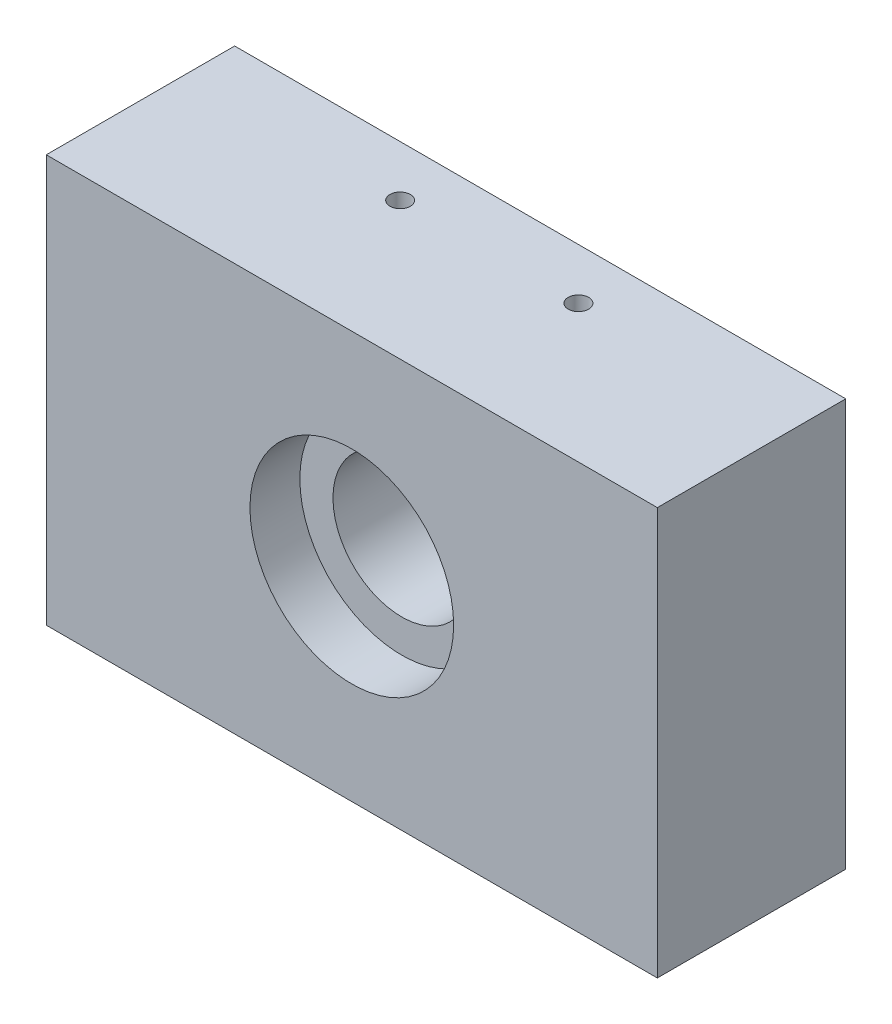
ISO-10303-21;
HEADER;
FILE_DESCRIPTION(('STEP AP214'),'2;1');
FILE_NAME('part.step','',(''),(''),'','','');
FILE_SCHEMA(('AUTOMOTIVE_DESIGN { 1 0 10303 214 1 1 1 1 }'));
ENDSEC;
DATA;
#1=APPLICATION_CONTEXT('core data for automotive mechanical design processes');
#2=APPLICATION_PROTOCOL_DEFINITION('international standard','automotive_design',2000,#1);
#3=PRODUCT_CONTEXT('',#1,'mechanical');
#4=PRODUCT('Part','Part','',(#3));
#5=PRODUCT_RELATED_PRODUCT_CATEGORY('part','',(#4));
#6=PRODUCT_DEFINITION_FORMATION('','',#4);
#7=PRODUCT_DEFINITION_CONTEXT('part definition',#1,'design');
#8=PRODUCT_DEFINITION('design','',#6,#7);
#9=PRODUCT_DEFINITION_SHAPE('','',#8);
#10=(LENGTH_UNIT() NAMED_UNIT(*) SI_UNIT(.MILLI.,.METRE.));
#11=(NAMED_UNIT(*) PLANE_ANGLE_UNIT() SI_UNIT($,.RADIAN.));
#12=(NAMED_UNIT(*) SI_UNIT($,.STERADIAN.) SOLID_ANGLE_UNIT());
#13=UNCERTAINTY_MEASURE_WITH_UNIT(LENGTH_MEASURE(1.E-05),#10,'distance_accuracy_value','');
#14=(GEOMETRIC_REPRESENTATION_CONTEXT(3) GLOBAL_UNCERTAINTY_ASSIGNED_CONTEXT((#13)) GLOBAL_UNIT_ASSIGNED_CONTEXT((#10,
#11,#12)) REPRESENTATION_CONTEXT('',''));
#15=CARTESIAN_POINT('',(0.,0.,0.));
#16=DIRECTION('',(0.,0.,1.));
#17=DIRECTION('',(1.,0.,0.));
#18=AXIS2_PLACEMENT_3D('',#15,#16,#17);
#19=CARTESIAN_POINT('',(76.2,50.8,46.99));
#20=DIRECTION('',(0.,0.,-1.));
#21=DIRECTION('',(-1.,0.,0.));
#22=AXIS2_PLACEMENT_3D('',#19,#20,#21);
#23=CYLINDRICAL_SURFACE('',#22,17.145);
#24=CARTESIAN_POINT('',(76.2,50.8,12.446));
#25=DIRECTION('',(0.,0.,-1.));
#26=DIRECTION('',(-1.,0.,0.));
#27=AXIS2_PLACEMENT_3D('',#24,#25,#26);
#28=CIRCLE('',#27,17.145);
#29=CARTESIAN_POINT('',(59.055,50.8,12.446));
#30=VERTEX_POINT('',#29);
#31=EDGE_CURVE('E147',#30,#30,#28,.T.);
#32=ORIENTED_EDGE('',*,*,#31,.T.);
#33=EDGE_LOOP('',(#32));
#34=FACE_BOUND('',#33,.T.);
#35=CARTESIAN_POINT('',(76.2,50.8,34.544));
#36=DIRECTION('',(0.,0.,-1.));
#37=DIRECTION('',(-1.,0.,0.));
#38=AXIS2_PLACEMENT_3D('',#35,#36,#37);
#39=CIRCLE('',#38,17.145);
#40=CARTESIAN_POINT('',(59.055,50.8,34.544));
#41=VERTEX_POINT('',#40);
#42=EDGE_CURVE('E140',#41,#41,#39,.T.);
#43=ORIENTED_EDGE('',*,*,#42,.F.);
#44=EDGE_LOOP('',(#43));
#45=FACE_BOUND('',#44,.T.);
#46=ADVANCED_FACE('F46',(#34,#45),#23,.F.);
#47=CARTESIAN_POINT('',(0.,0.,46.99));
#48=DIRECTION('',(0.,0.,-1.));
#49=DIRECTION('',(-1.,0.,0.));
#50=AXIS2_PLACEMENT_3D('',#47,#48,#49);
#51=PLANE('',#50);
#52=DIRECTION('',(0.,-1.,0.));
#53=VECTOR('',#52,1.);
#54=CARTESIAN_POINT('',(0.,0.,46.99));
#55=LINE('',#54,#53);
#56=CARTESIAN_POINT('',(0.,101.6,46.99));
#57=VERTEX_POINT('',#56);
#58=CARTESIAN_POINT('',(0.,0.,46.99));
#59=VERTEX_POINT('',#58);
#60=EDGE_CURVE('E159',#57,#59,#55,.T.);
#61=ORIENTED_EDGE('',*,*,#60,.T.);
#62=DIRECTION('',(1.,0.,0.));
#63=VECTOR('',#62,1.);
#64=CARTESIAN_POINT('',(0.,0.,46.99));
#65=LINE('',#64,#63);
#66=CARTESIAN_POINT('',(152.4,0.,46.99));
#67=VERTEX_POINT('',#66);
#68=EDGE_CURVE('E94',#59,#67,#65,.T.);
#69=ORIENTED_EDGE('',*,*,#68,.T.);
#70=DIRECTION('',(0.,1.,0.));
#71=VECTOR('',#70,1.);
#72=CARTESIAN_POINT('',(152.4,0.,46.99));
#73=LINE('',#72,#71);
#74=CARTESIAN_POINT('',(152.4,101.6,46.99));
#75=VERTEX_POINT('',#74);
#76=EDGE_CURVE('E162',#67,#75,#73,.T.);
#77=ORIENTED_EDGE('',*,*,#76,.T.);
#78=DIRECTION('',(-1.,0.,0.));
#79=VECTOR('',#78,1.);
#80=CARTESIAN_POINT('',(0.,101.6,46.99));
#81=LINE('',#80,#79);
#82=EDGE_CURVE('E63',#75,#57,#81,.T.);
#83=ORIENTED_EDGE('',*,*,#82,.T.);
#84=EDGE_LOOP('',(#61,#69,#77,#83));
#85=FACE_BOUND('',#84,.T.);
#86=CARTESIAN_POINT('',(76.2,50.8,46.99));
#87=DIRECTION('',(0.,0.,-1.));
#88=DIRECTION('',(-1.,0.,0.));
#89=AXIS2_PLACEMENT_3D('',#86,#87,#88);
#90=CIRCLE('',#89,25.4);
#91=CARTESIAN_POINT('',(50.8,50.8,46.99));
#92=VERTEX_POINT('',#91);
#93=EDGE_CURVE('E143',#92,#92,#90,.T.);
#94=ORIENTED_EDGE('',*,*,#93,.T.);
#95=EDGE_LOOP('',(#94));
#96=FACE_BOUND('',#95,.T.);
#97=ADVANCED_FACE('F198',(#85,#96),#51,.F.);
#98=CARTESIAN_POINT('',(0.,0.,46.99));
#99=DIRECTION('',(1.,0.,0.));
#100=DIRECTION('',(0.,1.,0.));
#101=AXIS2_PLACEMENT_3D('',#98,#99,#100);
#102=PLANE('',#101);
#103=DIRECTION('',(0.,-1.,0.));
#104=VECTOR('',#103,1.);
#105=CARTESIAN_POINT('',(0.,0.,0.));
#106=LINE('',#105,#104);
#107=CARTESIAN_POINT('',(0.,101.6,0.));
#108=VERTEX_POINT('',#107);
#109=CARTESIAN_POINT('',(0.,0.,0.));
#110=VERTEX_POINT('',#109);
#111=EDGE_CURVE('E156',#108,#110,#106,.T.);
#112=ORIENTED_EDGE('',*,*,#111,.T.);
#113=DIRECTION('',(0.,0.,-1.));
#114=VECTOR('',#113,1.);
#115=CARTESIAN_POINT('',(0.,0.,46.99));
#116=LINE('',#115,#114);
#117=EDGE_CURVE('E11',#59,#110,#116,.T.);
#118=ORIENTED_EDGE('',*,*,#117,.F.);
#119=ORIENTED_EDGE('',*,*,#60,.F.);
#120=DIRECTION('',(0.,0.,-1.));
#121=VECTOR('',#120,1.);
#122=CARTESIAN_POINT('',(0.,101.6,46.99));
#123=LINE('',#122,#121);
#124=EDGE_CURVE('E165',#57,#108,#123,.T.);
#125=ORIENTED_EDGE('',*,*,#124,.T.);
#126=EDGE_LOOP('',(#112,#118,#119,#125));
#127=FACE_BOUND('',#126,.T.);
#128=ADVANCED_FACE('F48',(#127),#102,.F.);
#129=CARTESIAN_POINT('',(0.,0.,46.99));
#130=DIRECTION('',(0.,1.,0.));
#131=DIRECTION('',(0.,0.,1.));
#132=AXIS2_PLACEMENT_3D('',#129,#130,#131);
#133=PLANE('',#132);
#134=CARTESIAN_POINT('',(68.051669078,0.,23.495));
#135=DIRECTION('',(0.,-1.,0.));
#136=DIRECTION('',(0.,0.,-1.));
#137=AXIS2_PLACEMENT_3D('',#134,#135,#136);
#138=CIRCLE('',#137,5.35812999999999);
#139=CARTESIAN_POINT('',(68.051669078,0.,18.13687));
#140=VERTEX_POINT('',#139);
#141=EDGE_CURVE('E128',#140,#140,#138,.T.);
#142=ORIENTED_EDGE('',*,*,#141,.F.);
#143=EDGE_LOOP('',(#142));
#144=FACE_BOUND('',#143,.T.);
#145=CARTESIAN_POINT('',(29.951669078,0.,23.495));
#146=DIRECTION('',(0.,-1.,0.));
#147=DIRECTION('',(0.,0.,-1.));
#148=AXIS2_PLACEMENT_3D('',#145,#146,#147);
#149=CIRCLE('',#148,5.35812999999999);
#150=CARTESIAN_POINT('',(29.951669078,0.,18.13687));
#151=VERTEX_POINT('',#150);
#152=EDGE_CURVE('E134',#151,#151,#149,.T.);
#153=ORIENTED_EDGE('',*,*,#152,.F.);
#154=EDGE_LOOP('',(#153));
#155=FACE_BOUND('',#154,.T.);
#156=DIRECTION('',(1.,0.,0.));
#157=VECTOR('',#156,1.);
#158=CARTESIAN_POINT('',(0.,0.,0.));
#159=LINE('',#158,#157);
#160=CARTESIAN_POINT('',(152.4,0.,0.));
#161=VERTEX_POINT('',#160);
#162=EDGE_CURVE('E168',#110,#161,#159,.T.);
#163=ORIENTED_EDGE('',*,*,#162,.T.);
#164=DIRECTION('',(0.,0.,-1.));
#165=VECTOR('',#164,1.);
#166=CARTESIAN_POINT('',(152.4,0.,46.99));
#167=LINE('',#166,#165);
#168=EDGE_CURVE('E55',#67,#161,#167,.T.);
#169=ORIENTED_EDGE('',*,*,#168,.F.);
#170=ORIENTED_EDGE('',*,*,#68,.F.);
#171=ORIENTED_EDGE('',*,*,#117,.T.);
#172=EDGE_LOOP('',(#163,#169,#170,#171));
#173=FACE_BOUND('',#172,.T.);
#174=ADVANCED_FACE('F193',(#144,#155,#173),#133,.F.);
#175=CARTESIAN_POINT('',(152.4,0.,46.99));
#176=DIRECTION('',(-1.,0.,0.));
#177=DIRECTION('',(0.,-1.,0.));
#178=AXIS2_PLACEMENT_3D('',#175,#176,#177);
#179=PLANE('',#178);
#180=DIRECTION('',(0.,1.,0.));
#181=VECTOR('',#180,1.);
#182=CARTESIAN_POINT('',(152.4,0.,0.));
#183=LINE('',#182,#181);
#184=CARTESIAN_POINT('',(152.4,101.6,0.));
#185=VERTEX_POINT('',#184);
#186=EDGE_CURVE('E81',#161,#185,#183,.T.);
#187=ORIENTED_EDGE('',*,*,#186,.T.);
#188=DIRECTION('',(0.,0.,-1.));
#189=VECTOR('',#188,1.);
#190=CARTESIAN_POINT('',(152.4,101.6,46.99));
#191=LINE('',#190,#189);
#192=EDGE_CURVE('E173',#75,#185,#191,.T.);
#193=ORIENTED_EDGE('',*,*,#192,.F.);
#194=ORIENTED_EDGE('',*,*,#76,.F.);
#195=ORIENTED_EDGE('',*,*,#168,.T.);
#196=EDGE_LOOP('',(#187,#193,#194,#195));
#197=FACE_BOUND('',#196,.T.);
#198=ADVANCED_FACE('F175',(#197),#179,.F.);
#199=CARTESIAN_POINT('',(0.,101.6,46.99));
#200=DIRECTION('',(0.,-1.,0.));
#201=DIRECTION('',(0.,0.,-1.));
#202=AXIS2_PLACEMENT_3D('',#199,#200,#201);
#203=PLANE('',#202);
#204=CARTESIAN_POINT('',(98.425,101.6,12.7));
#205=DIRECTION('',(0.,1.,0.));
#206=DIRECTION('',(0.,0.,1.));
#207=AXIS2_PLACEMENT_3D('',#204,#205,#206);
#208=CIRCLE('',#207,2.55269999999999);
#209=CARTESIAN_POINT('',(98.425,101.6,15.2527));
#210=VERTEX_POINT('',#209);
#211=EDGE_CURVE('E118',#210,#210,#208,.T.);
#212=ORIENTED_EDGE('',*,*,#211,.F.);
#213=EDGE_LOOP('',(#212));
#214=FACE_BOUND('',#213,.T.);
#215=CARTESIAN_POINT('',(53.975,101.6,12.7));
#216=DIRECTION('',(0.,1.,0.));
#217=DIRECTION('',(0.,0.,1.));
#218=AXIS2_PLACEMENT_3D('',#215,#216,#217);
#219=CIRCLE('',#218,2.55269999999999);
#220=CARTESIAN_POINT('',(53.975,101.6,15.2527));
#221=VERTEX_POINT('',#220);
#222=EDGE_CURVE('E117',#221,#221,#219,.T.);
#223=ORIENTED_EDGE('',*,*,#222,.F.);
#224=EDGE_LOOP('',(#223));
#225=FACE_BOUND('',#224,.T.);
#226=DIRECTION('',(-1.,0.,0.));
#227=VECTOR('',#226,1.);
#228=CARTESIAN_POINT('',(0.,101.6,0.));
#229=LINE('',#228,#227);
#230=EDGE_CURVE('E87',#185,#108,#229,.T.);
#231=ORIENTED_EDGE('',*,*,#230,.T.);
#232=ORIENTED_EDGE('',*,*,#124,.F.);
#233=ORIENTED_EDGE('',*,*,#82,.F.);
#234=ORIENTED_EDGE('',*,*,#192,.T.);
#235=EDGE_LOOP('',(#231,#232,#233,#234));
#236=FACE_BOUND('',#235,.T.);
#237=ADVANCED_FACE('F182',(#214,#225,#236),#203,.F.);
#238=CARTESIAN_POINT('',(0.,0.,0.));
#239=DIRECTION('',(0.,0.,-1.));
#240=DIRECTION('',(-1.,0.,0.));
#241=AXIS2_PLACEMENT_3D('',#238,#239,#240);
#242=PLANE('',#241);
#243=CARTESIAN_POINT('',(76.2,50.8,0.));
#244=DIRECTION('',(0.,0.,-1.));
#245=DIRECTION('',(-1.,0.,0.));
#246=AXIS2_PLACEMENT_3D('',#243,#244,#245);
#247=CIRCLE('',#246,25.4);
#248=CARTESIAN_POINT('',(50.8,50.8,0.));
#249=VERTEX_POINT('',#248);
#250=EDGE_CURVE('E152',#249,#249,#247,.T.);
#251=ORIENTED_EDGE('',*,*,#250,.F.);
#252=EDGE_LOOP('',(#251));
#253=FACE_BOUND('',#252,.T.);
#254=ORIENTED_EDGE('',*,*,#111,.F.);
#255=ORIENTED_EDGE('',*,*,#230,.F.);
#256=ORIENTED_EDGE('',*,*,#186,.F.);
#257=ORIENTED_EDGE('',*,*,#162,.F.);
#258=EDGE_LOOP('',(#254,#255,#256,#257));
#259=FACE_BOUND('',#258,.T.);
#260=ADVANCED_FACE('F178',(#253,#259),#242,.T.);
#261=CARTESIAN_POINT('',(76.2,50.8,12.446));
#262=DIRECTION('',(0.,0.,-1.));
#263=DIRECTION('',(-1.,0.,0.));
#264=AXIS2_PLACEMENT_3D('',#261,#262,#263);
#265=CYLINDRICAL_SURFACE('',#264,25.4);
#266=CARTESIAN_POINT('',(76.2,50.8,12.446));
#267=DIRECTION('',(0.,0.,-1.));
#268=DIRECTION('',(-1.,0.,0.));
#269=AXIS2_PLACEMENT_3D('',#266,#267,#268);
#270=CIRCLE('',#269,25.4);
#271=CARTESIAN_POINT('',(50.8,50.8,12.446));
#272=VERTEX_POINT('',#271);
#273=EDGE_CURVE('E153',#272,#272,#270,.T.);
#274=ORIENTED_EDGE('',*,*,#273,.F.);
#275=EDGE_LOOP('',(#274));
#276=FACE_BOUND('',#275,.T.);
#277=ORIENTED_EDGE('',*,*,#250,.T.);
#278=EDGE_LOOP('',(#277));
#279=FACE_BOUND('',#278,.T.);
#280=ADVANCED_FACE('F190',(#276,#279),#265,.F.);
#281=CARTESIAN_POINT('',(76.2,50.8,12.446));
#282=DIRECTION('',(0.,0.,-1.));
#283=DIRECTION('',(-1.,0.,0.));
#284=AXIS2_PLACEMENT_3D('',#281,#282,#283);
#285=PLANE('',#284);
#286=ORIENTED_EDGE('',*,*,#31,.F.);
#287=EDGE_LOOP('',(#286));
#288=FACE_BOUND('',#287,.T.);
#289=ORIENTED_EDGE('',*,*,#273,.T.);
#290=EDGE_LOOP('',(#289));
#291=FACE_BOUND('',#290,.T.);
#292=ADVANCED_FACE('F209',(#288,#291),#285,.T.);
#293=CARTESIAN_POINT('',(76.2,50.8,34.544));
#294=DIRECTION('',(0.,0.,1.));
#295=DIRECTION('',(-1.,0.,0.));
#296=AXIS2_PLACEMENT_3D('',#293,#294,#295);
#297=PLANE('',#296);
#298=CARTESIAN_POINT('',(76.2,50.8,34.544));
#299=DIRECTION('',(0.,0.,-1.));
#300=DIRECTION('',(-1.,0.,0.));
#301=AXIS2_PLACEMENT_3D('',#298,#299,#300);
#302=CIRCLE('',#301,25.4);
#303=CARTESIAN_POINT('',(50.8,50.8,34.544));
#304=VERTEX_POINT('',#303);
#305=EDGE_CURVE('E144',#304,#304,#302,.T.);
#306=ORIENTED_EDGE('',*,*,#305,.F.);
#307=EDGE_LOOP('',(#306));
#308=FACE_BOUND('',#307,.T.);
#309=ORIENTED_EDGE('',*,*,#42,.T.);
#310=EDGE_LOOP('',(#309));
#311=FACE_BOUND('',#310,.T.);
#312=ADVANCED_FACE('F213',(#308,#311),#297,.T.);
#313=CARTESIAN_POINT('',(76.2,50.8,34.544));
#314=DIRECTION('',(0.,0.,1.));
#315=DIRECTION('',(1.,0.,0.));
#316=AXIS2_PLACEMENT_3D('',#313,#314,#315);
#317=CYLINDRICAL_SURFACE('',#316,25.4);
#318=ORIENTED_EDGE('',*,*,#305,.T.);
#319=EDGE_LOOP('',(#318));
#320=FACE_BOUND('',#319,.T.);
#321=ORIENTED_EDGE('',*,*,#93,.F.);
#322=EDGE_LOOP('',(#321));
#323=FACE_BOUND('',#322,.T.);
#324=ADVANCED_FACE('F215',(#320,#323),#317,.F.);
#325=CARTESIAN_POINT('',(29.951669078,19.05,23.495));
#326=DIRECTION('',(0.,-1.,0.));
#327=DIRECTION('',(0.,0.,-1.));
#328=AXIS2_PLACEMENT_3D('',#325,#326,#327);
#329=CONICAL_SURFACE('',#328,5.35813,1.02974425867665);
#330=CARTESIAN_POINT('',(29.951669078,22.2694893086301,23.495));
#331=VERTEX_POINT('',#330);
#332=VERTEX_LOOP('',#331);
#333=FACE_BOUND('',#332,.T.);
#334=CARTESIAN_POINT('',(29.951669078,19.05,23.495));
#335=DIRECTION('',(0.,-1.,0.));
#336=DIRECTION('',(0.,0.,-1.));
#337=AXIS2_PLACEMENT_3D('',#334,#335,#336);
#338=CIRCLE('',#337,5.35813);
#339=CARTESIAN_POINT('',(29.951669078,19.05,18.13687));
#340=VERTEX_POINT('',#339);
#341=EDGE_CURVE('E137',#340,#340,#338,.T.);
#342=ORIENTED_EDGE('',*,*,#341,.T.);
#343=EDGE_LOOP('',(#342));
#344=FACE_BOUND('',#343,.T.);
#345=ADVANCED_FACE('F218',(#333,#344),#329,.F.);
#346=CARTESIAN_POINT('',(29.951669078,0.,23.495));
#347=DIRECTION('',(0.,-1.,0.));
#348=DIRECTION('',(0.,0.,-1.));
#349=AXIS2_PLACEMENT_3D('',#346,#347,#348);
#350=CYLINDRICAL_SURFACE('',#349,5.35812999999999);
#351=ORIENTED_EDGE('',*,*,#341,.F.);
#352=EDGE_LOOP('',(#351));
#353=FACE_BOUND('',#352,.T.);
#354=ORIENTED_EDGE('',*,*,#152,.T.);
#355=EDGE_LOOP('',(#354));
#356=FACE_BOUND('',#355,.T.);
#357=ADVANCED_FACE('F225',(#353,#356),#350,.F.);
#358=CARTESIAN_POINT('',(68.051669078,19.05,23.495));
#359=DIRECTION('',(0.,-1.,0.));
#360=DIRECTION('',(0.,0.,-1.));
#361=AXIS2_PLACEMENT_3D('',#358,#359,#360);
#362=CONICAL_SURFACE('',#361,5.35813,1.02974425867665);
#363=CARTESIAN_POINT('',(68.051669078,22.2694893086301,23.495));
#364=VERTEX_POINT('',#363);
#365=VERTEX_LOOP('',#364);
#366=FACE_BOUND('',#365,.T.);
#367=CARTESIAN_POINT('',(68.051669078,19.05,23.495));
#368=DIRECTION('',(0.,-1.,0.));
#369=DIRECTION('',(0.,0.,-1.));
#370=AXIS2_PLACEMENT_3D('',#367,#368,#369);
#371=CIRCLE('',#370,5.35813);
#372=CARTESIAN_POINT('',(68.051669078,19.05,18.13687));
#373=VERTEX_POINT('',#372);
#374=EDGE_CURVE('E131',#373,#373,#371,.T.);
#375=ORIENTED_EDGE('',*,*,#374,.T.);
#376=EDGE_LOOP('',(#375));
#377=FACE_BOUND('',#376,.T.);
#378=ADVANCED_FACE('F229',(#366,#377),#362,.F.);
#379=CARTESIAN_POINT('',(68.051669078,0.,23.495));
#380=DIRECTION('',(0.,-1.,0.));
#381=DIRECTION('',(0.,0.,-1.));
#382=AXIS2_PLACEMENT_3D('',#379,#380,#381);
#383=CYLINDRICAL_SURFACE('',#382,5.35813);
#384=ORIENTED_EDGE('',*,*,#374,.F.);
#385=EDGE_LOOP('',(#384));
#386=FACE_BOUND('',#385,.T.);
#387=ORIENTED_EDGE('',*,*,#141,.T.);
#388=EDGE_LOOP('',(#387));
#389=FACE_BOUND('',#388,.T.);
#390=ADVANCED_FACE('F233',(#386,#389),#383,.F.);
#391=CARTESIAN_POINT('',(53.975,87.8938169021915,12.7));
#392=DIRECTION('',(0.,1.,0.));
#393=DIRECTION('',(0.,0.,1.));
#394=AXIS2_PLACEMENT_3D('',#391,#392,#393);
#395=CONICAL_SURFACE('',#394,2.5527,1.02974425867665);
#396=CARTESIAN_POINT('',(53.975,86.3599999999999,12.7));
#397=VERTEX_POINT('',#396);
#398=VERTEX_LOOP('',#397);
#399=FACE_BOUND('',#398,.T.);
#400=CARTESIAN_POINT('',(53.975,87.8938169021915,12.7));
#401=DIRECTION('',(0.,1.,0.));
#402=DIRECTION('',(0.,0.,1.));
#403=AXIS2_PLACEMENT_3D('',#400,#401,#402);
#404=CIRCLE('',#403,2.5527);
#405=CARTESIAN_POINT('',(53.975,87.8938169021915,15.2527));
#406=VERTEX_POINT('',#405);
#407=EDGE_CURVE('E121',#406,#406,#404,.T.);
#408=ORIENTED_EDGE('',*,*,#407,.T.);
#409=EDGE_LOOP('',(#408));
#410=FACE_BOUND('',#409,.T.);
#411=ADVANCED_FACE('F237',(#399,#410),#395,.F.);
#412=CARTESIAN_POINT('',(53.975,101.6,12.7));
#413=DIRECTION('',(0.,1.,0.));
#414=DIRECTION('',(0.,0.,1.));
#415=AXIS2_PLACEMENT_3D('',#412,#413,#414);
#416=CYLINDRICAL_SURFACE('',#415,2.55269999999999);
#417=ORIENTED_EDGE('',*,*,#407,.F.);
#418=EDGE_LOOP('',(#417));
#419=FACE_BOUND('',#418,.T.);
#420=ORIENTED_EDGE('',*,*,#222,.T.);
#421=EDGE_LOOP('',(#420));
#422=FACE_BOUND('',#421,.T.);
#423=ADVANCED_FACE('F111',(#419,#422),#416,.F.);
#424=CARTESIAN_POINT('',(98.425,87.8938169021915,12.7));
#425=DIRECTION('',(0.,1.,0.));
#426=DIRECTION('',(0.,0.,1.));
#427=AXIS2_PLACEMENT_3D('',#424,#425,#426);
#428=CONICAL_SURFACE('',#427,2.55269999999999,1.02974425867665);
#429=CARTESIAN_POINT('',(98.425,86.3599999999999,12.7));
#430=VERTEX_POINT('',#429);
#431=VERTEX_LOOP('',#430);
#432=FACE_BOUND('',#431,.T.);
#433=CARTESIAN_POINT('',(98.425,87.8938169021915,12.7));
#434=DIRECTION('',(0.,1.,0.));
#435=DIRECTION('',(0.,0.,1.));
#436=AXIS2_PLACEMENT_3D('',#433,#434,#435);
#437=CIRCLE('',#436,2.55269999999999);
#438=CARTESIAN_POINT('',(98.425,87.8938169021915,15.2527));
#439=VERTEX_POINT('',#438);
#440=EDGE_CURVE('E115',#439,#439,#437,.T.);
#441=ORIENTED_EDGE('',*,*,#440,.T.);
#442=EDGE_LOOP('',(#441));
#443=FACE_BOUND('',#442,.T.);
#444=ADVANCED_FACE('F107',(#432,#443),#428,.F.);
#445=CARTESIAN_POINT('',(98.425,101.6,12.7));
#446=DIRECTION('',(0.,1.,0.));
#447=DIRECTION('',(0.,0.,1.));
#448=AXIS2_PLACEMENT_3D('',#445,#446,#447);
#449=CYLINDRICAL_SURFACE('',#448,2.55269999999999);
#450=ORIENTED_EDGE('',*,*,#440,.F.);
#451=EDGE_LOOP('',(#450));
#452=FACE_BOUND('',#451,.T.);
#453=ORIENTED_EDGE('',*,*,#211,.T.);
#454=EDGE_LOOP('',(#453));
#455=FACE_BOUND('',#454,.T.);
#456=ADVANCED_FACE('F110',(#452,#455),#449,.F.);
#457=CLOSED_SHELL('',(#46,#97,#128,#174,#198,#237,#260,#280,#292,#312,#324,#345,#357,#378,#390,
#411,#423,#444,#456));
#458=MANIFOLD_SOLID_BREP('B2',#457);
#459=ADVANCED_BREP_SHAPE_REPRESENTATION('',(#18,#458),#14);
#460=SHAPE_DEFINITION_REPRESENTATION(#9,#459);
ENDSEC;
END-ISO-10303-21;
